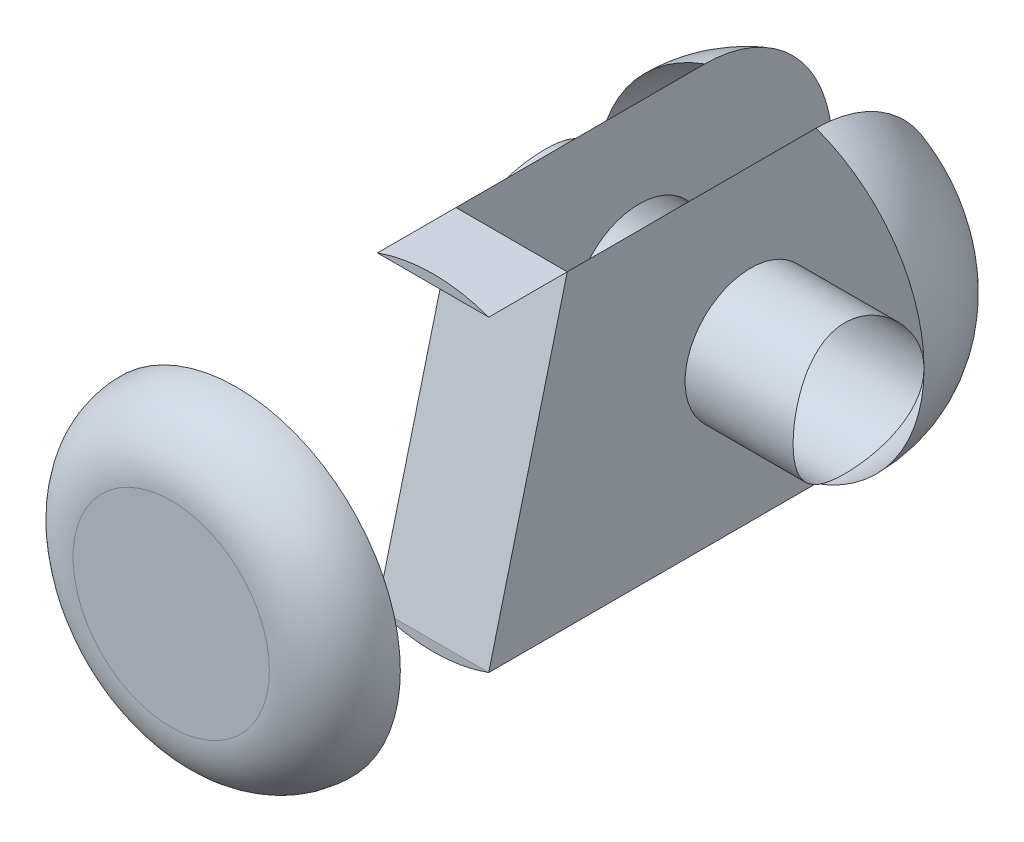
ISO-10303-21;
HEADER;
FILE_DESCRIPTION(('STEP AP214'),'2;1');
FILE_NAME('part.step','',(''),(''),'','','');
FILE_SCHEMA(('AUTOMOTIVE_DESIGN { 1 0 10303 214 1 1 1 1 }'));
ENDSEC;
DATA;
#1=APPLICATION_CONTEXT('core data for automotive mechanical design processes');
#2=APPLICATION_PROTOCOL_DEFINITION('international standard','automotive_design',2000,#1);
#3=PRODUCT_CONTEXT('',#1,'mechanical');
#4=PRODUCT('Part','Part','',(#3));
#5=PRODUCT_RELATED_PRODUCT_CATEGORY('part','',(#4));
#6=PRODUCT_DEFINITION_FORMATION('','',#4);
#7=PRODUCT_DEFINITION_CONTEXT('part definition',#1,'design');
#8=PRODUCT_DEFINITION('design','',#6,#7);
#9=PRODUCT_DEFINITION_SHAPE('','',#8);
#10=(LENGTH_UNIT() NAMED_UNIT(*) SI_UNIT(.MILLI.,.METRE.));
#11=(NAMED_UNIT(*) PLANE_ANGLE_UNIT() SI_UNIT($,.RADIAN.));
#12=(NAMED_UNIT(*) SI_UNIT($,.STERADIAN.) SOLID_ANGLE_UNIT());
#13=UNCERTAINTY_MEASURE_WITH_UNIT(LENGTH_MEASURE(1.E-05),#10,'distance_accuracy_value','');
#14=(GEOMETRIC_REPRESENTATION_CONTEXT(3) GLOBAL_UNCERTAINTY_ASSIGNED_CONTEXT((#13)) GLOBAL_UNIT_ASSIGNED_CONTEXT((#10,
#11,#12)) REPRESENTATION_CONTEXT('',''));
#15=CARTESIAN_POINT('',(0.,0.,0.));
#16=DIRECTION('',(0.,0.,1.));
#17=DIRECTION('',(1.,0.,0.));
#18=AXIS2_PLACEMENT_3D('',#15,#16,#17);
#19=CARTESIAN_POINT('',(0.,0.,0.));
#20=DIRECTION('',(0.,0.,1.));
#21=DIRECTION('',(1.,0.,0.));
#22=AXIS2_PLACEMENT_3D('',#19,#20,#21);
#23=PLANE('',#22);
#24=DIRECTION('',(-1.,0.,0.));
#25=VECTOR('',#24,1.);
#26=CARTESIAN_POINT('',(500000.,-2.35106358910175,0.));
#27=LINE('',#26,#25);
#28=CARTESIAN_POINT('',(0.850000000014006,-2.35106358910175,0.));
#29=VERTEX_POINT('',#28);
#30=CARTESIAN_POINT('',(-0.85,-2.35106358910175,0.));
#31=VERTEX_POINT('',#30);
#32=EDGE_CURVE('E105',#29,#31,#27,.T.);
#33=ORIENTED_EDGE('',*,*,#32,.F.);
#34=CARTESIAN_POINT('',(0.,0.,0.));
#35=DIRECTION('',(0.,0.,1.));
#36=DIRECTION('',(1.,0.,0.));
#37=AXIS2_PLACEMENT_3D('',#34,#35,#36);
#38=CIRCLE('',#37,2.5);
#39=EDGE_CURVE('E132',#31,#29,#38,.T.);
#40=ORIENTED_EDGE('',*,*,#39,.F.);
#41=EDGE_LOOP('',(#33,#40));
#42=FACE_BOUND('',#41,.T.);
#43=ADVANCED_FACE('F33',(#42),#23,.F.);
#44=DIRECTION('',(-1.,0.,0.));
#45=VECTOR('',#44,1.);
#46=CARTESIAN_POINT('',(500000.,2.35106358910175,0.));
#47=LINE('',#46,#45);
#48=CARTESIAN_POINT('',(0.85,2.35106358910175,0.));
#49=VERTEX_POINT('',#48);
#50=CARTESIAN_POINT('',(-0.85,2.35106358910175,0.));
#51=VERTEX_POINT('',#50);
#52=EDGE_CURVE('E93',#49,#51,#47,.T.);
#53=ORIENTED_EDGE('',*,*,#52,.T.);
#54=EDGE_CURVE('E131',#49,#51,#38,.T.);
#55=ORIENTED_EDGE('',*,*,#54,.F.);
#56=EDGE_LOOP('',(#53,#55));
#57=FACE_BOUND('',#56,.T.);
#58=ADVANCED_FACE('F154',(#57),#23,.F.);
#59=CARTESIAN_POINT('',(-0.85,-2.35106358910175,-7.));
#60=DIRECTION('',(-1.,0.,0.));
#61=DIRECTION('',(0.,0.,1.));
#62=AXIS2_PLACEMENT_3D('',#59,#60,#61);
#63=PLANE('',#62);
#64=CARTESIAN_POINT('',(-0.85,0.,-4.));
#65=DIRECTION('',(-1.,0.,0.));
#66=DIRECTION('',(0.,0.,1.));
#67=AXIS2_PLACEMENT_3D('',#64,#65,#66);
#68=CIRCLE('',#67,1.);
#69=CARTESIAN_POINT('',(-0.85,0.,-3.));
#70=VERTEX_POINT('',#69);
#71=EDGE_CURVE('E138',#70,#70,#68,.T.);
#72=ORIENTED_EDGE('',*,*,#71,.T.);
#73=EDGE_LOOP('',(#72));
#74=FACE_BOUND('',#73,.T.);
#75=DIRECTION('',(0.,0.968944530499406,-0.247278176989573));
#76=VECTOR('',#75,1.);
#77=CARTESIAN_POINT('',(-0.85,-2.35106358910175,0.));
#78=LINE('',#77,#76);
#79=CARTESIAN_POINT('',(-0.85,2.35106358910175,-1.2));
#80=VERTEX_POINT('',#79);
#81=EDGE_CURVE('E103',#31,#80,#78,.T.);
#82=ORIENTED_EDGE('',*,*,#81,.F.);
#83=DIRECTION('',(0.,0.,1.));
#84=VECTOR('',#83,1.);
#85=CARTESIAN_POINT('',(-0.85,-2.35106358910175,-7.));
#86=LINE('',#85,#84);
#87=CARTESIAN_POINT('',(-0.85,-2.35106358910175,-5.));
#88=VERTEX_POINT('',#87);
#89=EDGE_CURVE('E116',#88,#31,#86,.T.);
#90=ORIENTED_EDGE('',*,*,#89,.F.);
#91=CARTESIAN_POINT('',(-0.85,-2.35106358910175,-5.));
#92=CARTESIAN_POINT('',(-0.85,-2.35106355728871,-5.05314044910896));
#93=CARTESIAN_POINT('',(-0.85,-2.34881003954397,-5.10625524769209));
#94=CARTESIAN_POINT('',(-0.85,-2.33982215273719,-5.21210041969455));
#95=CARTESIAN_POINT('',(-0.85,-2.33308811152647,-5.26483082095582));
#96=CARTESIAN_POINT('',(-0.85,-2.30624124042803,-5.42173915599286));
#97=CARTESIAN_POINT('',(-0.85,-2.27948340785009,-5.52485848547282));
#98=CARTESIAN_POINT('',(-0.85,-2.20904594442091,-5.7251245246379));
#99=CARTESIAN_POINT('',(-0.85,-2.1653600988853,-5.82226902562391));
#100=CARTESIAN_POINT('',(-0.85,-2.06240032225791,-6.00790558496152));
#101=CARTESIAN_POINT('',(-0.85,-2.00312803198713,-6.09639855273562));
#102=CARTESIAN_POINT('',(-0.85,-1.87036481450185,-6.26290242793188));
#103=CARTESIAN_POINT('',(-0.85,-1.79678498861863,-6.34084234308079));
#104=CARTESIAN_POINT('',(-0.85,-1.63788066476916,-6.48365362842474));
#105=CARTESIAN_POINT('',(-0.85,-1.55255368692038,-6.54852223205799));
#106=CARTESIAN_POINT('',(-0.85,-1.37017906943086,-6.66550924727885));
#107=CARTESIAN_POINT('',(-0.85,-1.27286887084407,-6.71721677449447));
#108=CARTESIAN_POINT('',(-0.85,-1.07155878395424,-6.80492674865599));
#109=CARTESIAN_POINT('',(-0.85,-0.967564249896955,-6.84094159011378));
#110=CARTESIAN_POINT('',(-0.85,-0.791841808794076,-6.88848988857193));
#111=CARTESIAN_POINT('',(-0.85,-0.721186484168305,-6.90418368456777));
#112=CARTESIAN_POINT('',(-0.85,-0.578832325376815,-6.92989519516053));
#113=CARTESIAN_POINT('',(-0.85,-0.507133094605757,-6.93991069149271));
#114=CARTESIAN_POINT('',(-0.85,-0.362947389881542,-6.95526647280427));
#115=CARTESIAN_POINT('',(-0.85,-0.290458845413078,-6.96058615078207));
#116=CARTESIAN_POINT('',(-0.85,-0.14531345989149,-6.96752151742024));
#117=CARTESIAN_POINT('',(-0.85,-0.0726566074505903,-6.96913694766048));
#118=CARTESIAN_POINT('',(-0.85,0.0722135324935883,-6.96913678633597));
#119=CARTESIAN_POINT('',(-0.85,0.144426822975759,-6.96754083813286));
#120=CARTESIAN_POINT('',(-0.85,0.288688396887551,-6.9606932160647));
#121=CARTESIAN_POINT('',(-0.85,0.360736693932491,-6.95544185561688));
#122=CARTESIAN_POINT('',(-0.85,0.504060002600872,-6.94029540103068));
#123=CARTESIAN_POINT('',(-0.85,0.575336992770698,-6.93041995025506));
#124=CARTESIAN_POINT('',(-0.85,0.716891078162531,-6.90506036632046));
#125=CARTESIAN_POINT('',(-0.85,0.787168483847116,-6.88957801597884));
#126=CARTESIAN_POINT('',(-0.85,0.913888893225653,-6.85559927654579));
#127=CARTESIAN_POINT('',(-0.85,0.970599231279335,-6.83810561913072));
#128=CARTESIAN_POINT('',(-0.85,1.08244701603224,-6.79865693401));
#129=CARTESIAN_POINT('',(-0.85,1.13758421039442,-6.77670119510999));
#130=CARTESIAN_POINT('',(-0.85,1.30003724279776,-6.70394231145284));
#131=CARTESIAN_POINT('',(-0.85,1.40439060888476,-6.64624851654856));
#132=CARTESIAN_POINT('',(-0.85,1.60159669735931,-6.51299780858169));
#133=CARTESIAN_POINT('',(-0.85,1.69440155612714,-6.43737009620238));
#134=CARTESIAN_POINT('',(-0.85,1.86460441430524,-6.27036480597041));
#135=CARTESIAN_POINT('',(-0.85,1.94200537461333,-6.17899026124635));
#136=CARTESIAN_POINT('',(-0.85,2.07298633597169,-5.99127611282059));
#137=CARTESIAN_POINT('',(-0.85,2.12797460219868,-5.89591501538724));
#138=CARTESIAN_POINT('',(-0.85,2.22062634449778,-5.69714322956575));
#139=CARTESIAN_POINT('',(-0.85,2.25830101231621,-5.59373779184683));
#140=CARTESIAN_POINT('',(-0.85,2.3080412595776,-5.40841117938462));
#141=CARTESIAN_POINT('',(-0.85,2.32414699540176,-5.32754886284584));
#142=CARTESIAN_POINT('',(-0.85,2.34566736516696,-5.16446994477972));
#143=CARTESIAN_POINT('',(-0.85,2.35108912831612,-5.0822542832764));
#144=CARTESIAN_POINT('',(-0.85,2.35106358910175,-5.));
#145=B_SPLINE_CURVE_WITH_KNOTS('',3,(#91,#92,#93,#94,#95,#96,#97,#98,#99,#100,#101,#102,#103,
#104,#105,#106,#107,#108,#109,#110,#111,#112,#113,#114,#115,#116,#117,#118,#119,#120,#121,#122,
#123,#124,#125,#126,#127,#128,#129,#130,#131,#132,#133,#134,#135,#136,#137,#138,#139,#140,#141,
#142,#143,#144),.UNSPECIFIED.,.F.,.F.,(4,2,2,2,2,2,2,2,2,2,2,2,2,2,2,2,2,2,2,2,2,2,2,2,2,2,4),
(0.,0.159322722769761,0.318633788772249,0.636591754096125,0.954666560268357,1.2727078953674,
1.59279242680609,1.91294463360036,2.24212011501426,2.57103513127166,2.7879356764742,
3.00492089700407,3.2228536624324,3.44080163108284,3.65742050813065,3.87402081443452,
4.08970922567333,4.3053291149238,4.48318669094384,4.66107263727621,5.01685653588594,
5.37406908953257,5.7312129142403,6.05984902931056,6.38827240966012,6.63494902851517,
6.88146098902543),.UNSPECIFIED.);
#146=CARTESIAN_POINT('',(-0.85,2.35106358910175,-5.));
#147=VERTEX_POINT('',#146);
#148=EDGE_CURVE('E134',#88,#147,#145,.T.);
#149=ORIENTED_EDGE('',*,*,#148,.T.);
#150=DIRECTION('',(0.,0.,1.));
#151=VECTOR('',#150,1.);
#152=CARTESIAN_POINT('',(-0.85,2.35106358910175,-7.));
#153=LINE('',#152,#151);
#154=EDGE_CURVE('E128',#147,#80,#153,.T.);
#155=ORIENTED_EDGE('',*,*,#154,.T.);
#156=EDGE_LOOP('',(#82,#90,#149,#155));
#157=FACE_BOUND('',#156,.T.);
#158=ADVANCED_FACE('F149',(#74,#157),#63,.F.);
#159=CARTESIAN_POINT('',(0.85,-2.35106358910175,-7.));
#160=DIRECTION('',(1.,0.,0.));
#161=DIRECTION('',(0.,0.,-1.));
#162=AXIS2_PLACEMENT_3D('',#159,#160,#161);
#163=PLANE('',#162);
#164=CARTESIAN_POINT('',(0.85,0.,-4.));
#165=DIRECTION('',(1.,0.,0.));
#166=DIRECTION('',(0.,0.,-1.));
#167=AXIS2_PLACEMENT_3D('',#164,#165,#166);
#168=CIRCLE('',#167,1.);
#169=CARTESIAN_POINT('',(0.85,0.,-5.));
#170=VERTEX_POINT('',#169);
#171=EDGE_CURVE('E135',#170,#170,#168,.T.);
#172=ORIENTED_EDGE('',*,*,#171,.T.);
#173=EDGE_LOOP('',(#172));
#174=FACE_BOUND('',#173,.T.);
#175=DIRECTION('',(0.,0.968944530499406,-0.247278176989573));
#176=VECTOR('',#175,1.);
#177=CARTESIAN_POINT('',(0.850000000014006,-2.35106358910175,0.));
#178=LINE('',#177,#176);
#179=CARTESIAN_POINT('',(0.850000000014006,2.35106358910175,-1.2));
#180=VERTEX_POINT('',#179);
#181=EDGE_CURVE('E96',#29,#180,#178,.T.);
#182=ORIENTED_EDGE('',*,*,#181,.T.);
#183=DIRECTION('',(0.,0.,1.));
#184=VECTOR('',#183,1.);
#185=CARTESIAN_POINT('',(0.85,2.35106358910175,-7.));
#186=LINE('',#185,#184);
#187=CARTESIAN_POINT('',(0.85,2.35106358910175,-5.));
#188=VERTEX_POINT('',#187);
#189=EDGE_CURVE('E108',#188,#180,#186,.T.);
#190=ORIENTED_EDGE('',*,*,#189,.F.);
#191=CARTESIAN_POINT('',(0.85,2.35106358910175,-5.));
#192=CARTESIAN_POINT('',(0.85,2.35106355728871,-5.05314044910896));
#193=CARTESIAN_POINT('',(0.85,2.34881003954397,-5.10625524769209));
#194=CARTESIAN_POINT('',(0.85,2.33982215273719,-5.21210041969455));
#195=CARTESIAN_POINT('',(0.85,2.33308811152647,-5.26483082095582));
#196=CARTESIAN_POINT('',(0.85,2.30624124042803,-5.42173915599286));
#197=CARTESIAN_POINT('',(0.85,2.27948340785009,-5.52485848547282));
#198=CARTESIAN_POINT('',(0.85,2.20904594442091,-5.7251245246379));
#199=CARTESIAN_POINT('',(0.85,2.1653600988853,-5.82226902562391));
#200=CARTESIAN_POINT('',(0.85,2.06240032225791,-6.00790558496152));
#201=CARTESIAN_POINT('',(0.85,2.00312803198713,-6.09639855273562));
#202=CARTESIAN_POINT('',(0.85,1.87036481450185,-6.26290242793188));
#203=CARTESIAN_POINT('',(0.85,1.79678498861863,-6.34084234308079));
#204=CARTESIAN_POINT('',(0.85,1.63788066476916,-6.48365362842474));
#205=CARTESIAN_POINT('',(0.85,1.55255368692038,-6.54852223205799));
#206=CARTESIAN_POINT('',(0.85,1.37017906943086,-6.66550924727885));
#207=CARTESIAN_POINT('',(0.85,1.27286887084407,-6.71721677449447));
#208=CARTESIAN_POINT('',(0.85,1.07155878395424,-6.80492674865599));
#209=CARTESIAN_POINT('',(0.85,0.967564249896955,-6.84094159011378));
#210=CARTESIAN_POINT('',(0.85,0.791841808794076,-6.88848988857193));
#211=CARTESIAN_POINT('',(0.85,0.721186484168305,-6.90418368456777));
#212=CARTESIAN_POINT('',(0.85,0.578832325376815,-6.92989519516053));
#213=CARTESIAN_POINT('',(0.85,0.507133094605757,-6.93991069149271));
#214=CARTESIAN_POINT('',(0.85,0.362947389881542,-6.95526647280427));
#215=CARTESIAN_POINT('',(0.85,0.290458845413078,-6.96058615078207));
#216=CARTESIAN_POINT('',(0.85,0.14531345989149,-6.96752151742024));
#217=CARTESIAN_POINT('',(0.85,0.0726566074505903,-6.96913694766048));
#218=CARTESIAN_POINT('',(0.85,-0.0722135324935883,-6.96913678633597));
#219=CARTESIAN_POINT('',(0.85,-0.144426822975759,-6.96754083813286));
#220=CARTESIAN_POINT('',(0.85,-0.288688396887551,-6.9606932160647));
#221=CARTESIAN_POINT('',(0.85,-0.360736693932491,-6.95544185561688));
#222=CARTESIAN_POINT('',(0.85,-0.504060002600872,-6.94029540103068));
#223=CARTESIAN_POINT('',(0.85,-0.575336992770698,-6.93041995025506));
#224=CARTESIAN_POINT('',(0.85,-0.716891078162531,-6.90506036632046));
#225=CARTESIAN_POINT('',(0.85,-0.787168483847116,-6.88957801597884));
#226=CARTESIAN_POINT('',(0.85,-0.913888893225653,-6.85559927654579));
#227=CARTESIAN_POINT('',(0.85,-0.970599231279335,-6.83810561913072));
#228=CARTESIAN_POINT('',(0.85,-1.08244701603224,-6.79865693401));
#229=CARTESIAN_POINT('',(0.85,-1.13758421039442,-6.77670119510999));
#230=CARTESIAN_POINT('',(0.85,-1.30003724279776,-6.70394231145284));
#231=CARTESIAN_POINT('',(0.85,-1.40439060888476,-6.64624851654856));
#232=CARTESIAN_POINT('',(0.85,-1.60159669735931,-6.51299780858169));
#233=CARTESIAN_POINT('',(0.85,-1.69440155612714,-6.43737009620238));
#234=CARTESIAN_POINT('',(0.85,-1.86460441430524,-6.27036480597041));
#235=CARTESIAN_POINT('',(0.85,-1.94200537461333,-6.17899026124635));
#236=CARTESIAN_POINT('',(0.85,-2.07298633597169,-5.99127611282059));
#237=CARTESIAN_POINT('',(0.85,-2.12797460219868,-5.89591501538724));
#238=CARTESIAN_POINT('',(0.85,-2.22062634449778,-5.69714322956575));
#239=CARTESIAN_POINT('',(0.85,-2.25830101231621,-5.59373779184683));
#240=CARTESIAN_POINT('',(0.85,-2.3080412595776,-5.40841117938462));
#241=CARTESIAN_POINT('',(0.85,-2.32414699540176,-5.32754886284584));
#242=CARTESIAN_POINT('',(0.85,-2.34566736516696,-5.16446994477972));
#243=CARTESIAN_POINT('',(0.85,-2.35108912831612,-5.0822542832764));
#244=CARTESIAN_POINT('',(0.85,-2.35106358910175,-5.));
#245=B_SPLINE_CURVE_WITH_KNOTS('',3,(#191,#192,#193,#194,#195,#196,#197,#198,#199,#200,#201,
#202,#203,#204,#205,#206,#207,#208,#209,#210,#211,#212,#213,#214,#215,#216,#217,#218,#219,#220,
#221,#222,#223,#224,#225,#226,#227,#228,#229,#230,#231,#232,#233,#234,#235,#236,#237,#238,#239,
#240,#241,#242,#243,#244),.UNSPECIFIED.,.F.,.F.,(4,2,2,2,2,2,2,2,2,2,2,2,2,2,2,2,2,2,2,2,2,2,2,
2,2,2,4),(0.,0.159322722769761,0.318633788772249,0.636591754096125,0.954666560268357,
1.2727078953674,1.59279242680609,1.91294463360036,2.24212011501426,2.57103513127166,
2.7879356764742,3.00492089700407,3.2228536624324,3.44080163108284,3.65742050813065,
3.87402081443452,4.08970922567333,4.3053291149238,4.48318669094384,4.66107263727621,
5.01685653588594,5.37406908953257,5.7312129142403,6.05984902931056,6.38827240966012,
6.63494902851517,6.88146098902543),.UNSPECIFIED.);
#246=CARTESIAN_POINT('',(0.85,-2.35106358910175,-5.));
#247=VERTEX_POINT('',#246);
#248=EDGE_CURVE('E55',#188,#247,#245,.T.);
#249=ORIENTED_EDGE('',*,*,#248,.T.);
#250=DIRECTION('',(0.,0.,1.));
#251=VECTOR('',#250,1.);
#252=CARTESIAN_POINT('',(0.85,-2.35106358910175,-7.));
#253=LINE('',#252,#251);
#254=EDGE_CURVE('E109',#247,#29,#253,.T.);
#255=ORIENTED_EDGE('',*,*,#254,.T.);
#256=EDGE_LOOP('',(#182,#190,#249,#255));
#257=FACE_BOUND('',#256,.T.);
#258=ADVANCED_FACE('F107',(#174,#257),#163,.F.);
#259=CARTESIAN_POINT('',(0.,0.,4.));
#260=DIRECTION('',(0.,0.,-1.));
#261=DIRECTION('',(-1.,0.,0.));
#262=AXIS2_PLACEMENT_3D('',#259,#260,#261);
#263=CYLINDRICAL_SURFACE('',#262,2.5);
#264=CARTESIAN_POINT('',(0.,0.,3.));
#265=DIRECTION('',(0.,0.,1.));
#266=DIRECTION('',(1.,0.,0.));
#267=AXIS2_PLACEMENT_3D('',#264,#265,#266);
#268=CIRCLE('',#267,2.5);
#269=CARTESIAN_POINT('',(2.5,0.,3.));
#270=VERTEX_POINT('',#269);
#271=EDGE_CURVE('E11',#270,#270,#268,.F.);
#272=ORIENTED_EDGE('',*,*,#271,.T.);
#273=EDGE_LOOP('',(#272));
#274=FACE_BOUND('',#273,.T.);
#275=ORIENTED_EDGE('',*,*,#154,.F.);
#276=CARTESIAN_POINT('',(0.,0.,-5.));
#277=DIRECTION('',(0.,0.,-1.));
#278=DIRECTION('',(-1.,0.,0.));
#279=AXIS2_PLACEMENT_3D('',#276,#277,#278);
#280=CIRCLE('',#279,2.5);
#281=CARTESIAN_POINT('',(-2.5,0.,-5.));
#282=VERTEX_POINT('',#281);
#283=EDGE_CURVE('E198',#147,#282,#280,.F.);
#284=ORIENTED_EDGE('',*,*,#283,.T.);
#285=CARTESIAN_POINT('',(-2.5,0.,-3.));
#286=CARTESIAN_POINT('',(-2.49999635613542,-0.0537465027214457,-3.00000492591186));
#287=CARTESIAN_POINT('',(-2.49824647153466,-0.107586282045337,-3.00435887604419));
#288=CARTESIAN_POINT('',(-2.49141726550321,-0.213748240208948,-3.02162385176062));
#289=CARTESIAN_POINT('',(-2.48632889349439,-0.266065888780624,-3.03455813954307));
#290=CARTESIAN_POINT('',(-2.47337104606559,-0.367476961363702,-3.06843803902942));
#291=CARTESIAN_POINT('',(-2.46551068182036,-0.41658033080848,-3.08935742310837));
#292=CARTESIAN_POINT('',(-2.44778305398039,-0.510535985164184,-3.13850958666327));
#293=CARTESIAN_POINT('',(-2.43791648729028,-0.555389738375496,-3.16673982745947));
#294=CARTESIAN_POINT('',(-2.41665443085209,-0.641750503785197,-3.23111774928047));
#295=CARTESIAN_POINT('',(-2.40521148464595,-0.683031136275107,-3.26755332812013));
#296=CARTESIAN_POINT('',(-2.38230288453097,-0.759087502392361,-3.34670000173839));
#297=CARTESIAN_POINT('',(-2.37083722226896,-0.793860053566766,-3.38941414860587));
#298=CARTESIAN_POINT('',(-2.34861395898568,-0.85743728364644,-3.48221403512113));
#299=CARTESIAN_POINT('',(-2.33791057982476,-0.885907490597737,-3.5325432430116));
#300=CARTESIAN_POINT('',(-2.31916823593396,-0.933877359518574,-3.63776819921002));
#301=CARTESIAN_POINT('',(-2.31112800622088,-0.953381282142917,-3.69266176392418));
#302=CARTESIAN_POINT('',(-2.29913178830409,-0.981949411697934,-3.80285616679605));
#303=CARTESIAN_POINT('',(-2.29500710177802,-0.991446982902824,-3.85802561778811));
#304=CARTESIAN_POINT('',(-2.29082002024572,-1.00108648082001,-3.96931749915364));
#305=CARTESIAN_POINT('',(-2.29075562761384,-1.00123300815661,-4.02543944731251));
#306=CARTESIAN_POINT('',(-2.29455250139997,-0.992494683752272,-4.13287833572902));
#307=CARTESIAN_POINT('',(-2.29814087519225,-0.984237657152568,-4.18425785720452));
#308=CARTESIAN_POINT('',(-2.30838093803918,-0.95997344014891,-4.28482977800336));
#309=CARTESIAN_POINT('',(-2.31503316160836,-0.943964897402316,-4.33402179405516));
#310=CARTESIAN_POINT('',(-2.33079742544265,-0.904347366275536,-4.43000891809802));
#311=CARTESIAN_POINT('',(-2.33995689640394,-0.880589931157658,-4.47673461952735));
#312=CARTESIAN_POINT('',(-2.35969058194945,-0.826253230366106,-4.56570790818078));
#313=CARTESIAN_POINT('',(-2.37026532728424,-0.795671402550422,-4.6079538047014));
#314=CARTESIAN_POINT('',(-2.39263368371135,-0.725775299727217,-4.690204864401));
#315=CARTESIAN_POINT('',(-2.40445832488076,-0.685968731485317,-4.72978436472301));
#316=CARTESIAN_POINT('',(-2.42729912479141,-0.600157213715096,-4.80184223900102));
#317=CARTESIAN_POINT('',(-2.43831512222662,-0.554151032667217,-4.83431919870515));
#318=CARTESIAN_POINT('',(-2.45857340632274,-0.456038826302922,-4.89180872370792));
#319=CARTESIAN_POINT('',(-2.46777635047707,-0.403830245673239,-4.91666114059853));
#320=CARTESIAN_POINT('',(-2.48307414164379,-0.295511882741441,-4.95708393053903));
#321=CARTESIAN_POINT('',(-2.48917056731191,-0.239404098424837,-4.97265901877871));
#322=CARTESIAN_POINT('',(-2.49728069753455,-0.12844794380391,-4.99322414770985));
#323=CARTESIAN_POINT('',(-2.49951472916757,-0.0737216469927671,-4.99878622712678));
#324=CARTESIAN_POINT('',(-2.50034239255315,0.0359226549039086,-5.00085655026431));
#325=CARTESIAN_POINT('',(-2.49893696791146,0.0908406066119618,-4.99736714077376));
#326=CARTESIAN_POINT('',(-2.49278783531876,0.196716369560994,-4.98185412372401));
#327=CARTESIAN_POINT('',(-2.48819695672762,0.247741245887737,-4.97022100982451));
#328=CARTESIAN_POINT('',(-2.4762972070275,0.34706771403039,-4.93928214584509));
#329=CARTESIAN_POINT('',(-2.46898798678265,0.395368955112422,-4.91997541016566));
#330=CARTESIAN_POINT('',(-2.45208297385406,0.489539392908351,-4.87360753016003));
#331=CARTESIAN_POINT('',(-2.44242407989902,0.535289011377703,-4.84632726397843));
#332=CARTESIAN_POINT('',(-2.42186682372762,0.621721795623278,-4.78502983804718));
#333=CARTESIAN_POINT('',(-2.41096796555135,0.662402920380563,-4.75100997853869));
#334=CARTESIAN_POINT('',(-2.38822558819056,0.74036152151441,-4.67456499352519));
#335=CARTESIAN_POINT('',(-2.37636720712526,0.777236966903032,-4.6317332292469));
#336=CARTESIAN_POINT('',(-2.35370836458566,0.843375598706856,-4.54027995849532));
#337=CARTESIAN_POINT('',(-2.34290807763255,0.872637530668754,-4.49165749983003));
#338=CARTESIAN_POINT('',(-2.32357149953854,0.922903750965814,-4.38926915270295));
#339=CARTESIAN_POINT('',(-2.31505815442394,0.943825297267227,-4.33545800039384));
#340=CARTESIAN_POINT('',(-2.30161836738966,0.976148109852653,-4.22463317414242));
#341=CARTESIAN_POINT('',(-2.29668927847999,0.987556402634658,-4.16762189709379));
#342=CARTESIAN_POINT('',(-2.29135879649963,0.999857808639201,-4.05643604911273));
#343=CARTESIAN_POINT('',(-2.29065710504086,1.00144854115143,-4.00235258020332));
#344=CARTESIAN_POINT('',(-2.29307418016549,0.995901579638762,-3.89472757114335));
#345=CARTESIAN_POINT('',(-2.29619246162397,0.988764993956891,-3.84118596304871));
#346=CARTESIAN_POINT('',(-2.3056332453951,0.966535683076824,-3.73833390507248));
#347=CARTESIAN_POINT('',(-2.31182415913725,0.951768746785489,-3.6889398627835));
#348=CARTESIAN_POINT('',(-2.32662000616348,0.915002724245507,-3.59331068519326));
#349=CARTESIAN_POINT('',(-2.33522560603003,0.893001640696907,-3.54707642655009));
#350=CARTESIAN_POINT('',(-2.35449304802246,0.840936381379866,-3.45619519036461));
#351=CARTESIAN_POINT('',(-2.36524441156621,0.810482667579745,-3.41179066493476));
#352=CARTESIAN_POINT('',(-2.38731902186119,0.742946059635748,-3.32850334139812));
#353=CARTESIAN_POINT('',(-2.39864244024203,0.70586116740906,-3.28962221393584));
#354=CARTESIAN_POINT('',(-2.42146783543697,0.623252753136231,-3.21589857336819));
#355=CARTESIAN_POINT('',(-2.43293378981093,0.577338000573069,-3.18148134655097));
#356=CARTESIAN_POINT('',(-2.45400203356858,0.479950160142889,-3.12083147868918));
#357=CARTESIAN_POINT('',(-2.46360345546453,0.428474502273619,-3.09460264392374));
#358=CARTESIAN_POINT('',(-2.47969857407931,0.322369031247602,-3.05168889240486));
#359=CARTESIAN_POINT('',(-2.48624681527514,0.267815809109848,-3.03483533821983));
#360=CARTESIAN_POINT('',(-2.49572153104683,0.156438273140611,-3.01068043952287));
#361=CARTESIAN_POINT('',(-2.49865949747819,0.0996217629294565,-3.00334878162805));
#362=CARTESIAN_POINT('',(-2.49987949752068,0.0284561489454648,-3.00030230951086));
#363=CARTESIAN_POINT('',(-2.50000096484588,0.0142313443703792,-2.9999986956854));
#364=CARTESIAN_POINT('',(-2.5,0.,-3.));
#365=B_SPLINE_CURVE_WITH_KNOTS('',3,(#285,#286,#287,#288,#289,#290,#291,#292,#293,#294,#295,
#296,#297,#298,#299,#300,#301,#302,#303,#304,#305,#306,#307,#308,#309,#310,#311,#312,#313,#314,
#315,#316,#317,#318,#319,#320,#321,#322,#323,#324,#325,#326,#327,#328,#329,#330,#331,#332,#333,
#334,#335,#336,#337,#338,#339,#340,#341,#342,#343,#344,#345,#346,#347,#348,#349,#350,#351,#352,
#353,#354,#355,#356,#357,#358,#359,#360,#361,#362,#363,#364),.UNSPECIFIED.,.T.,.F.,(4,2,2,2,2,2,
2,2,2,2,2,2,2,2,2,2,2,2,2,2,2,2,2,2,2,2,2,2,2,2,2,2,2,2,2,2,2,2,2,4),(0.,0.161201493946536,
0.322841818003967,0.483955728735791,0.645013767839921,0.812986908501986,0.981041974672057,
1.15657629409608,1.33202711559134,1.49952052654414,1.66693153170244,1.82269164200686,
1.97847893628024,2.13744563149408,2.29647210969092,2.46779174593278,2.63914546419866,
2.81388456581403,2.98853478056895,3.15284592264004,3.31711446785041,3.47400227782183,
3.63091024496898,3.79261756699131,3.95438979749484,4.12684237312207,4.29932334521874,
4.47347522570414,4.64749836322967,4.80899836696374,4.97047786281523,5.12557159274385,
5.28070817902581,5.44472734028346,5.60879600674197,5.78350211766918,5.95828931820266,
6.12982150506659,6.30080626202171,6.34349022948398),.UNSPECIFIED.);
#366=EDGE_CURVE('E118',#282,#282,#365,.T.);
#367=ORIENTED_EDGE('',*,*,#366,.T.);
#368=CARTESIAN_POINT('',(0.,0.,-5.));
#369=DIRECTION('',(0.,0.,-1.));
#370=DIRECTION('',(-1.,0.,0.));
#371=AXIS2_PLACEMENT_3D('',#368,#369,#370);
#372=CIRCLE('',#371,2.5);
#373=EDGE_CURVE('E204',#282,#88,#372,.F.);
#374=ORIENTED_EDGE('',*,*,#373,.T.);
#375=ORIENTED_EDGE('',*,*,#89,.T.);
#376=ORIENTED_EDGE('',*,*,#39,.T.);
#377=ORIENTED_EDGE('',*,*,#254,.F.);
#378=CARTESIAN_POINT('',(0.,0.,-5.));
#379=DIRECTION('',(0.,0.,1.));
#380=DIRECTION('',(1.,0.,0.));
#381=AXIS2_PLACEMENT_3D('',#378,#379,#380);
#382=CIRCLE('',#381,2.5);
#383=CARTESIAN_POINT('',(2.5,0.,-5.));
#384=VERTEX_POINT('',#383);
#385=EDGE_CURVE('E205',#247,#384,#382,.T.);
#386=ORIENTED_EDGE('',*,*,#385,.T.);
#387=CARTESIAN_POINT('',(2.5,0.,-3.));
#388=CARTESIAN_POINT('',(2.49999635613542,0.0537465027214457,-3.00000492591186));
#389=CARTESIAN_POINT('',(2.49824647153466,0.107586282045337,-3.00435887604419));
#390=CARTESIAN_POINT('',(2.49141726550321,0.213748240208948,-3.02162385176062));
#391=CARTESIAN_POINT('',(2.48632889349439,0.266065888780624,-3.03455813954307));
#392=CARTESIAN_POINT('',(2.47337104606559,0.367476961363702,-3.06843803902942));
#393=CARTESIAN_POINT('',(2.46551068182036,0.41658033080848,-3.08935742310837));
#394=CARTESIAN_POINT('',(2.44778305398039,0.510535985164184,-3.13850958666327));
#395=CARTESIAN_POINT('',(2.43791648729028,0.555389738375496,-3.16673982745947));
#396=CARTESIAN_POINT('',(2.41665443085209,0.641750503785197,-3.23111774928047));
#397=CARTESIAN_POINT('',(2.40521148464595,0.683031136275107,-3.26755332812013));
#398=CARTESIAN_POINT('',(2.38230288453097,0.759087502392361,-3.34670000173839));
#399=CARTESIAN_POINT('',(2.37083722226896,0.793860053566766,-3.38941414860587));
#400=CARTESIAN_POINT('',(2.34861395898568,0.85743728364644,-3.48221403512113));
#401=CARTESIAN_POINT('',(2.33791057982476,0.885907490597737,-3.5325432430116));
#402=CARTESIAN_POINT('',(2.31916823593396,0.933877359518574,-3.63776819921002));
#403=CARTESIAN_POINT('',(2.31112800622088,0.953381282142917,-3.69266176392418));
#404=CARTESIAN_POINT('',(2.29913178830409,0.981949411697934,-3.80285616679605));
#405=CARTESIAN_POINT('',(2.29500710177802,0.991446982902824,-3.85802561778811));
#406=CARTESIAN_POINT('',(2.29082002024572,1.00108648082001,-3.96931749915364));
#407=CARTESIAN_POINT('',(2.29075562761384,1.00123300815661,-4.02543944731251));
#408=CARTESIAN_POINT('',(2.29455250139997,0.992494683752272,-4.13287833572902));
#409=CARTESIAN_POINT('',(2.29814087519225,0.984237657152568,-4.18425785720452));
#410=CARTESIAN_POINT('',(2.30838093803918,0.95997344014891,-4.28482977800336));
#411=CARTESIAN_POINT('',(2.31503316160836,0.943964897402316,-4.33402179405516));
#412=CARTESIAN_POINT('',(2.33079742544265,0.904347366275536,-4.43000891809802));
#413=CARTESIAN_POINT('',(2.33995689640394,0.880589931157658,-4.47673461952735));
#414=CARTESIAN_POINT('',(2.35969058194945,0.826253230366106,-4.56570790818078));
#415=CARTESIAN_POINT('',(2.37026532728424,0.795671402550422,-4.6079538047014));
#416=CARTESIAN_POINT('',(2.39263368371135,0.725775299727217,-4.690204864401));
#417=CARTESIAN_POINT('',(2.40445832488076,0.685968731485317,-4.72978436472301));
#418=CARTESIAN_POINT('',(2.42729912479141,0.600157213715096,-4.80184223900102));
#419=CARTESIAN_POINT('',(2.43831512222662,0.554151032667217,-4.83431919870515));
#420=CARTESIAN_POINT('',(2.45857340632274,0.456038826302922,-4.89180872370792));
#421=CARTESIAN_POINT('',(2.46777635047707,0.403830245673239,-4.91666114059853));
#422=CARTESIAN_POINT('',(2.48307414164379,0.295511882741441,-4.95708393053903));
#423=CARTESIAN_POINT('',(2.48917056731191,0.239404098424837,-4.97265901877871));
#424=CARTESIAN_POINT('',(2.49728069753455,0.12844794380391,-4.99322414770985));
#425=CARTESIAN_POINT('',(2.49951472916757,0.0737216469927671,-4.99878622712678));
#426=CARTESIAN_POINT('',(2.50034239255315,-0.0359226549039086,-5.00085655026431));
#427=CARTESIAN_POINT('',(2.49893696791146,-0.0908406066119618,-4.99736714077376));
#428=CARTESIAN_POINT('',(2.49278783531876,-0.196716369560994,-4.98185412372401));
#429=CARTESIAN_POINT('',(2.48819695672762,-0.247741245887737,-4.97022100982451));
#430=CARTESIAN_POINT('',(2.4762972070275,-0.34706771403039,-4.93928214584509));
#431=CARTESIAN_POINT('',(2.46898798678265,-0.395368955112422,-4.91997541016566));
#432=CARTESIAN_POINT('',(2.45208297385406,-0.489539392908351,-4.87360753016003));
#433=CARTESIAN_POINT('',(2.44242407989902,-0.535289011377703,-4.84632726397843));
#434=CARTESIAN_POINT('',(2.42186682372762,-0.621721795623278,-4.78502983804718));
#435=CARTESIAN_POINT('',(2.41096796555135,-0.662402920380563,-4.75100997853869));
#436=CARTESIAN_POINT('',(2.38822558819056,-0.74036152151441,-4.67456499352519));
#437=CARTESIAN_POINT('',(2.37636720712526,-0.777236966903032,-4.6317332292469));
#438=CARTESIAN_POINT('',(2.35370836458566,-0.843375598706856,-4.54027995849532));
#439=CARTESIAN_POINT('',(2.34290807763255,-0.872637530668754,-4.49165749983003));
#440=CARTESIAN_POINT('',(2.32357149953854,-0.922903750965814,-4.38926915270295));
#441=CARTESIAN_POINT('',(2.31505815442394,-0.943825297267227,-4.33545800039384));
#442=CARTESIAN_POINT('',(2.30161836738966,-0.976148109852653,-4.22463317414242));
#443=CARTESIAN_POINT('',(2.29668927847999,-0.987556402634658,-4.16762189709379));
#444=CARTESIAN_POINT('',(2.29135879649963,-0.999857808639201,-4.05643604911273));
#445=CARTESIAN_POINT('',(2.29065710504086,-1.00144854115143,-4.00235258020332));
#446=CARTESIAN_POINT('',(2.29307418016549,-0.995901579638762,-3.89472757114335));
#447=CARTESIAN_POINT('',(2.29619246162397,-0.988764993956891,-3.84118596304871));
#448=CARTESIAN_POINT('',(2.3056332453951,-0.966535683076824,-3.73833390507248));
#449=CARTESIAN_POINT('',(2.31182415913725,-0.951768746785489,-3.6889398627835));
#450=CARTESIAN_POINT('',(2.32662000616348,-0.915002724245507,-3.59331068519326));
#451=CARTESIAN_POINT('',(2.33522560603003,-0.893001640696907,-3.54707642655009));
#452=CARTESIAN_POINT('',(2.35449304802246,-0.840936381379866,-3.45619519036461));
#453=CARTESIAN_POINT('',(2.36524441156621,-0.810482667579745,-3.41179066493476));
#454=CARTESIAN_POINT('',(2.38731902186119,-0.742946059635748,-3.32850334139812));
#455=CARTESIAN_POINT('',(2.39864244024203,-0.70586116740906,-3.28962221393584));
#456=CARTESIAN_POINT('',(2.42146783543697,-0.623252753136231,-3.21589857336819));
#457=CARTESIAN_POINT('',(2.43293378981093,-0.577338000573069,-3.18148134655097));
#458=CARTESIAN_POINT('',(2.45400203356858,-0.479950160142889,-3.12083147868918));
#459=CARTESIAN_POINT('',(2.46360345546453,-0.428474502273619,-3.09460264392374));
#460=CARTESIAN_POINT('',(2.47969857407931,-0.322369031247602,-3.05168889240486));
#461=CARTESIAN_POINT('',(2.48624681527514,-0.267815809109848,-3.03483533821983));
#462=CARTESIAN_POINT('',(2.49572153104683,-0.156438273140611,-3.01068043952287));
#463=CARTESIAN_POINT('',(2.49865949747819,-0.0996217629294565,-3.00334878162805));
#464=CARTESIAN_POINT('',(2.49987949752068,-0.0284561489454648,-3.00030230951086));
#465=CARTESIAN_POINT('',(2.50000096484588,-0.0142313443703792,-2.9999986956854));
#466=CARTESIAN_POINT('',(2.5,0.,-3.));
#467=B_SPLINE_CURVE_WITH_KNOTS('',3,(#387,#388,#389,#390,#391,#392,#393,#394,#395,#396,#397,
#398,#399,#400,#401,#402,#403,#404,#405,#406,#407,#408,#409,#410,#411,#412,#413,#414,#415,#416,
#417,#418,#419,#420,#421,#422,#423,#424,#425,#426,#427,#428,#429,#430,#431,#432,#433,#434,#435,
#436,#437,#438,#439,#440,#441,#442,#443,#444,#445,#446,#447,#448,#449,#450,#451,#452,#453,#454,
#455,#456,#457,#458,#459,#460,#461,#462,#463,#464,#465,#466),.UNSPECIFIED.,.T.,.F.,(4,2,2,2,2,2,
2,2,2,2,2,2,2,2,2,2,2,2,2,2,2,2,2,2,2,2,2,2,2,2,2,2,2,2,2,2,2,2,2,4),(0.,0.161201493946536,
0.322841818003967,0.483955728735791,0.645013767839921,0.812986908501986,0.981041974672057,
1.15657629409608,1.33202711559134,1.49952052654414,1.66693153170244,1.82269164200686,
1.97847893628024,2.13744563149408,2.29647210969092,2.46779174593278,2.63914546419866,
2.81388456581403,2.98853478056895,3.15284592264004,3.31711446785041,3.47400227782183,
3.63091024496898,3.79261756699131,3.95438979749484,4.12684237312207,4.29932334521874,
4.47347522570414,4.64749836322967,4.80899836696374,4.97047786281523,5.12557159274385,
5.28070817902581,5.44472734028346,5.60879600674197,5.78350211766918,5.95828931820266,
6.12982150506659,6.30080626202171,6.34349022948398),.UNSPECIFIED.);
#468=EDGE_CURVE('E114',#384,#384,#467,.T.);
#469=ORIENTED_EDGE('',*,*,#468,.T.);
#470=CARTESIAN_POINT('',(0.,0.,-5.));
#471=DIRECTION('',(0.,0.,1.));
#472=DIRECTION('',(1.,0.,0.));
#473=AXIS2_PLACEMENT_3D('',#470,#471,#472);
#474=CIRCLE('',#473,2.5);
#475=EDGE_CURVE('E48',#384,#188,#474,.T.);
#476=ORIENTED_EDGE('',*,*,#475,.T.);
#477=ORIENTED_EDGE('',*,*,#189,.T.);
#478=DIRECTION('',(0.,0.,1.));
#479=VECTOR('',#478,1.);
#480=CARTESIAN_POINT('',(0.850000000014006,2.35106358910175,-1.2));
#481=LINE('',#480,#479);
#482=EDGE_CURVE('E87',#180,#49,#481,.T.);
#483=ORIENTED_EDGE('',*,*,#482,.T.);
#484=ORIENTED_EDGE('',*,*,#54,.T.);
#485=DIRECTION('',(0.,0.,1.));
#486=VECTOR('',#485,1.);
#487=CARTESIAN_POINT('',(-0.85,2.35106358910175,-1.2));
#488=LINE('',#487,#486);
#489=EDGE_CURVE('E139',#80,#51,#488,.T.);
#490=ORIENTED_EDGE('',*,*,#489,.F.);
#491=EDGE_LOOP('',(#275,#284,#367,#374,#375,#376,#377,#386,#469,#476,#477,#483,#484,#490));
#492=FACE_BOUND('',#491,.T.);
#493=ADVANCED_FACE('F113',(#274,#492),#263,.T.);
#494=CARTESIAN_POINT('',(0.,0.,4.));
#495=DIRECTION('',(0.,0.,1.));
#496=DIRECTION('',(1.,0.,0.));
#497=AXIS2_PLACEMENT_3D('',#494,#495,#496);
#498=PLANE('',#497);
#499=CARTESIAN_POINT('',(0.,0.,4.));
#500=DIRECTION('',(0.,0.,1.));
#501=DIRECTION('',(1.,0.,0.));
#502=AXIS2_PLACEMENT_3D('',#499,#500,#501);
#503=CIRCLE('',#502,1.5);
#504=CARTESIAN_POINT('',(1.5,0.,4.));
#505=VERTEX_POINT('',#504);
#506=EDGE_CURVE('E41',#505,#505,#503,.T.);
#507=ORIENTED_EDGE('',*,*,#506,.T.);
#508=EDGE_LOOP('',(#507));
#509=FACE_BOUND('',#508,.T.);
#510=ADVANCED_FACE('F157',(#509),#498,.T.);
#511=CARTESIAN_POINT('',(2.5,0.,-4.));
#512=DIRECTION('',(-1.,0.,0.));
#513=DIRECTION('',(0.,0.,1.));
#514=AXIS2_PLACEMENT_3D('',#511,#512,#513);
#515=CYLINDRICAL_SURFACE('',#514,1.);
#516=ORIENTED_EDGE('',*,*,#171,.F.);
#517=EDGE_LOOP('',(#516));
#518=FACE_BOUND('',#517,.T.);
#519=ORIENTED_EDGE('',*,*,#468,.F.);
#520=EDGE_LOOP('',(#519));
#521=FACE_BOUND('',#520,.T.);
#522=ADVANCED_FACE('F160',(#518,#521),#515,.F.);
#523=ORIENTED_EDGE('',*,*,#71,.F.);
#524=EDGE_LOOP('',(#523));
#525=FACE_BOUND('',#524,.T.);
#526=ORIENTED_EDGE('',*,*,#366,.F.);
#527=EDGE_LOOP('',(#526));
#528=FACE_BOUND('',#527,.T.);
#529=ADVANCED_FACE('F175',(#525,#528),#515,.F.);
#530=CARTESIAN_POINT('',(0.,0.,-5.));
#531=DIRECTION('',(0.,0.,-1.));
#532=DIRECTION('',(-1.,0.,0.));
#533=AXIS2_PLACEMENT_3D('',#530,#531,#532);
#534=DEGENERATE_TOROIDAL_SURFACE('',#533,0.5,2.,.T.);
#535=ORIENTED_EDGE('',*,*,#373,.F.);
#536=ORIENTED_EDGE('',*,*,#283,.F.);
#537=ORIENTED_EDGE('',*,*,#148,.F.);
#538=EDGE_LOOP('',(#535,#536,#537));
#539=FACE_BOUND('',#538,.T.);
#540=ADVANCED_FACE('F147',(#539),#534,.T.);
#541=CARTESIAN_POINT('',(0.,0.,-5.));
#542=DIRECTION('',(0.,0.,1.));
#543=DIRECTION('',(1.,0.,0.));
#544=AXIS2_PLACEMENT_3D('',#541,#542,#543);
#545=DEGENERATE_TOROIDAL_SURFACE('',#544,0.5,2.,.T.);
#546=ORIENTED_EDGE('',*,*,#475,.F.);
#547=ORIENTED_EDGE('',*,*,#385,.F.);
#548=ORIENTED_EDGE('',*,*,#248,.F.);
#549=EDGE_LOOP('',(#546,#547,#548));
#550=FACE_BOUND('',#549,.T.);
#551=ADVANCED_FACE('F180',(#550),#545,.T.);
#552=CARTESIAN_POINT('',(500000.,-2.35106358910175,0.));
#553=DIRECTION('',(0.,0.247278176989573,0.968944530499406));
#554=DIRECTION('',(0.,-0.968944530499406,0.247278176989573));
#555=AXIS2_PLACEMENT_3D('',#552,#553,#554);
#556=PLANE('',#555);
#557=ORIENTED_EDGE('',*,*,#181,.F.);
#558=ORIENTED_EDGE('',*,*,#32,.T.);
#559=ORIENTED_EDGE('',*,*,#81,.T.);
#560=DIRECTION('',(-1.,0.,0.));
#561=VECTOR('',#560,1.);
#562=CARTESIAN_POINT('',(500000.,2.35106358910175,-1.2));
#563=LINE('',#562,#561);
#564=EDGE_CURVE('E90',#180,#80,#563,.T.);
#565=ORIENTED_EDGE('',*,*,#564,.F.);
#566=EDGE_LOOP('',(#557,#558,#559,#565));
#567=FACE_BOUND('',#566,.T.);
#568=ADVANCED_FACE('F100',(#567),#556,.F.);
#569=CARTESIAN_POINT('',(500000.,2.35106358910175,-1.2));
#570=DIRECTION('',(0.,-1.,0.));
#571=DIRECTION('',(0.,0.,-1.));
#572=AXIS2_PLACEMENT_3D('',#569,#570,#571);
#573=PLANE('',#572);
#574=ORIENTED_EDGE('',*,*,#482,.F.);
#575=ORIENTED_EDGE('',*,*,#564,.T.);
#576=ORIENTED_EDGE('',*,*,#489,.T.);
#577=ORIENTED_EDGE('',*,*,#52,.F.);
#578=EDGE_LOOP('',(#574,#575,#576,#577));
#579=FACE_BOUND('',#578,.T.);
#580=ADVANCED_FACE('F89',(#579),#573,.F.);
#581=CARTESIAN_POINT('',(0.,0.,3.));
#582=DIRECTION('',(0.,0.,1.));
#583=DIRECTION('',(1.,0.,0.));
#584=AXIS2_PLACEMENT_3D('',#581,#582,#583);
#585=TOROIDAL_SURFACE('',#584,1.5,1.);
#586=ORIENTED_EDGE('',*,*,#271,.F.);
#587=EDGE_LOOP('',(#586));
#588=FACE_BOUND('',#587,.T.);
#589=ORIENTED_EDGE('',*,*,#506,.F.);
#590=EDGE_LOOP('',(#589));
#591=FACE_BOUND('',#590,.T.);
#592=ADVANCED_FACE('F35',(#588,#591),#585,.T.);
#593=CLOSED_SHELL('',(#43,#58,#158,#258,#493,#510,#522,#529,#540,#551,#568,#580,#592));
#594=MANIFOLD_SOLID_BREP('B2',#593);
#595=ADVANCED_BREP_SHAPE_REPRESENTATION('',(#18,#594),#14);
#596=SHAPE_DEFINITION_REPRESENTATION(#9,#595);
ENDSEC;
END-ISO-10303-21;
